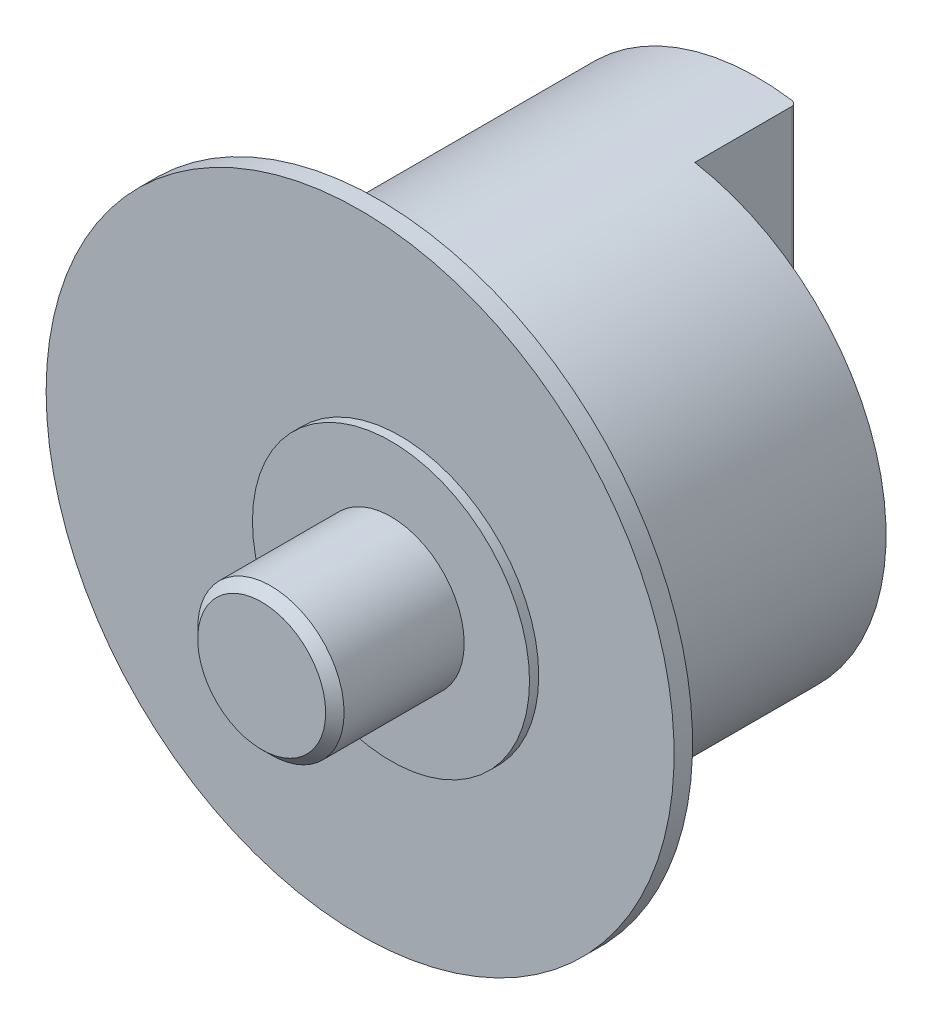
ISO-10303-21;
HEADER;
FILE_DESCRIPTION(('STEP AP214'),'2;1');
FILE_NAME('part.step','',(''),(''),'','','');
FILE_SCHEMA(('AUTOMOTIVE_DESIGN { 1 0 10303 214 1 1 1 1 }'));
ENDSEC;
DATA;
#1=APPLICATION_CONTEXT('core data for automotive mechanical design processes');
#2=APPLICATION_PROTOCOL_DEFINITION('international standard','automotive_design',2000,#1);
#3=PRODUCT_CONTEXT('',#1,'mechanical');
#4=PRODUCT('Part','Part','',(#3));
#5=PRODUCT_RELATED_PRODUCT_CATEGORY('part','',(#4));
#6=PRODUCT_DEFINITION_FORMATION('','',#4);
#7=PRODUCT_DEFINITION_CONTEXT('part definition',#1,'design');
#8=PRODUCT_DEFINITION('design','',#6,#7);
#9=PRODUCT_DEFINITION_SHAPE('','',#8);
#10=(LENGTH_UNIT() NAMED_UNIT(*) SI_UNIT(.MILLI.,.METRE.));
#11=(NAMED_UNIT(*) PLANE_ANGLE_UNIT() SI_UNIT($,.RADIAN.));
#12=(NAMED_UNIT(*) SI_UNIT($,.STERADIAN.) SOLID_ANGLE_UNIT());
#13=UNCERTAINTY_MEASURE_WITH_UNIT(LENGTH_MEASURE(1.E-05),#10,'distance_accuracy_value','');
#14=(GEOMETRIC_REPRESENTATION_CONTEXT(3) GLOBAL_UNCERTAINTY_ASSIGNED_CONTEXT((#13)) GLOBAL_UNIT_ASSIGNED_CONTEXT((#10,
#11,#12)) REPRESENTATION_CONTEXT('',''));
#15=CARTESIAN_POINT('',(0.,0.,0.));
#16=DIRECTION('',(0.,0.,1.));
#17=DIRECTION('',(1.,0.,0.));
#18=AXIS2_PLACEMENT_3D('',#15,#16,#17);
#19=CARTESIAN_POINT('',(0.,0.,0.));
#20=DIRECTION('',(0.,0.,1.));
#21=DIRECTION('',(1.,0.,0.));
#22=AXIS2_PLACEMENT_3D('',#19,#20,#21);
#23=PLANE('',#22);
#24=DIRECTION('',(0.,-1.,0.));
#25=VECTOR('',#24,1.);
#26=CARTESIAN_POINT('',(-0.0500000000000027,0.,0.));
#27=LINE('',#26,#25);
#28=CARTESIAN_POINT('',(-0.0500000000000027,-3.43910161513775,0.));
#29=VERTEX_POINT('',#28);
#30=CARTESIAN_POINT('',(-0.0500000000000027,-12.2935440374206,0.));
#31=VERTEX_POINT('',#30);
#32=EDGE_CURVE('E165',#29,#31,#27,.T.);
#33=ORIENTED_EDGE('',*,*,#32,.F.);
#34=DIRECTION('',(1.,0.,0.));
#35=VECTOR('',#34,1.);
#36=CARTESIAN_POINT('',(0.,-3.43910161513775,0.));
#37=LINE('',#36,#35);
#38=CARTESIAN_POINT('',(1.98556624327026,-3.43910161513775,0.));
#39=VERTEX_POINT('',#38);
#40=EDGE_CURVE('E213',#29,#39,#37,.T.);
#41=ORIENTED_EDGE('',*,*,#40,.T.);
#42=DIRECTION('',(0.499999999999999,0.866025403784439,0.));
#43=VECTOR('',#42,1.);
#44=CARTESIAN_POINT('',(2.97834936490539,-1.71955080756887,0.));
#45=LINE('',#44,#43);
#46=CARTESIAN_POINT('',(3.97113248654052,0.,0.));
#47=VERTEX_POINT('',#46);
#48=EDGE_CURVE('E193',#39,#47,#45,.T.);
#49=ORIENTED_EDGE('',*,*,#48,.T.);
#50=DIRECTION('',(-0.5,0.866025403784439,0.));
#51=VECTOR('',#50,1.);
#52=CARTESIAN_POINT('',(2.97834936490539,1.71955080756888,0.));
#53=LINE('',#52,#51);
#54=CARTESIAN_POINT('',(1.98556624327026,3.43910161513776,0.));
#55=VERTEX_POINT('',#54);
#56=EDGE_CURVE('E218',#47,#55,#53,.T.);
#57=ORIENTED_EDGE('',*,*,#56,.T.);
#58=DIRECTION('',(-1.,0.,0.));
#59=VECTOR('',#58,1.);
#60=CARTESIAN_POINT('',(0.,3.43910161513776,0.));
#61=LINE('',#60,#59);
#62=CARTESIAN_POINT('',(-0.0500000000000027,3.43910161513776,0.));
#63=VERTEX_POINT('',#62);
#64=EDGE_CURVE('E215',#55,#63,#61,.T.);
#65=ORIENTED_EDGE('',*,*,#64,.T.);
#66=CARTESIAN_POINT('',(-0.0500000000000027,12.2935440374206,0.));
#67=VERTEX_POINT('',#66);
#68=EDGE_CURVE('E162',#67,#63,#27,.T.);
#69=ORIENTED_EDGE('',*,*,#68,.F.);
#70=CARTESIAN_POINT('',(-2.17,0.,0.));
#71=DIRECTION('',(0.,0.,1.));
#72=DIRECTION('',(1.,0.,0.));
#73=AXIS2_PLACEMENT_3D('',#70,#71,#72);
#74=CIRCLE('',#73,12.475);
#75=EDGE_CURVE('E198',#31,#67,#74,.T.);
#76=ORIENTED_EDGE('',*,*,#75,.F.);
#77=EDGE_LOOP('',(#33,#41,#49,#57,#65,#69,#76));
#78=FACE_BOUND('',#77,.T.);
#79=ADVANCED_FACE('F39',(#78),#23,.F.);
#80=CARTESIAN_POINT('',(2.97834936490539,-1.71955080756887,10.5));
#81=DIRECTION('',(-0.866025403784439,0.499999999999999,0.));
#82=DIRECTION('',(-0.499999999999999,-0.866025403784439,0.));
#83=AXIS2_PLACEMENT_3D('',#80,#81,#82);
#84=PLANE('',#83);
#85=ORIENTED_EDGE('',*,*,#48,.F.);
#86=DIRECTION('',(0.,0.,-1.));
#87=VECTOR('',#86,1.);
#88=CARTESIAN_POINT('',(1.98556624327026,-3.43910161513775,10.5));
#89=LINE('',#88,#87);
#90=CARTESIAN_POINT('',(1.98556624327026,-3.43910161513775,10.5));
#91=VERTEX_POINT('',#90);
#92=EDGE_CURVE('E184',#91,#39,#89,.T.);
#93=ORIENTED_EDGE('',*,*,#92,.F.);
#94=DIRECTION('',(0.499999999999999,0.866025403784439,0.));
#95=VECTOR('',#94,1.);
#96=CARTESIAN_POINT('',(2.97834936490539,-1.71955080756887,10.5));
#97=LINE('',#96,#95);
#98=CARTESIAN_POINT('',(3.97113248654052,0.,10.5));
#99=VERTEX_POINT('',#98);
#100=EDGE_CURVE('E194',#91,#99,#97,.T.);
#101=ORIENTED_EDGE('',*,*,#100,.T.);
#102=DIRECTION('',(0.,0.,-1.));
#103=VECTOR('',#102,1.);
#104=CARTESIAN_POINT('',(3.97113248654052,0.,10.5));
#105=LINE('',#104,#103);
#106=EDGE_CURVE('E210',#99,#47,#105,.T.);
#107=ORIENTED_EDGE('',*,*,#106,.T.);
#108=EDGE_LOOP('',(#85,#93,#101,#107));
#109=FACE_BOUND('',#108,.T.);
#110=ADVANCED_FACE('F276',(#109),#84,.T.);
#111=CARTESIAN_POINT('',(0.,-3.43910161513775,10.5));
#112=DIRECTION('',(0.,1.,0.));
#113=DIRECTION('',(-1.,0.,0.));
#114=AXIS2_PLACEMENT_3D('',#111,#112,#113);
#115=PLANE('',#114);
#116=DIRECTION('',(0.,0.,1.));
#117=VECTOR('',#116,1.);
#118=CARTESIAN_POINT('',(-0.0500000000000027,-3.43910161513775,-5.5));
#119=LINE('',#118,#117);
#120=CARTESIAN_POINT('',(-0.0500000000000027,-3.43910161513775,-5.25));
#121=VERTEX_POINT('',#120);
#122=EDGE_CURVE('E167',#121,#29,#119,.T.);
#123=ORIENTED_EDGE('',*,*,#122,.F.);
#124=CARTESIAN_POINT('',(-0.300000000000003,-3.43910161513775,-5.25));
#125=DIRECTION('',(0.,1.,0.));
#126=DIRECTION('',(-1.,0.,0.));
#127=AXIS2_PLACEMENT_3D('',#124,#125,#126);
#128=CIRCLE('',#127,0.25);
#129=CARTESIAN_POINT('',(-0.300000000000003,-3.43910161513775,-5.5));
#130=VERTEX_POINT('',#129);
#131=EDGE_CURVE('E318',#121,#130,#128,.T.);
#132=ORIENTED_EDGE('',*,*,#131,.T.);
#133=DIRECTION('',(1.,0.,0.));
#134=VECTOR('',#133,1.);
#135=CARTESIAN_POINT('',(0.,-3.43910161513775,-5.5));
#136=LINE('',#135,#134);
#137=CARTESIAN_POINT('',(-1.98556624327026,-3.43910161513776,-5.5));
#138=VERTEX_POINT('',#137);
#139=EDGE_CURVE('E156',#138,#130,#136,.T.);
#140=ORIENTED_EDGE('',*,*,#139,.F.);
#141=DIRECTION('',(0.,0.,-1.));
#142=VECTOR('',#141,1.);
#143=CARTESIAN_POINT('',(-1.98556624327026,-3.43910161513776,10.5));
#144=LINE('',#143,#142);
#145=CARTESIAN_POINT('',(-1.98556624327026,-3.43910161513776,10.5));
#146=VERTEX_POINT('',#145);
#147=EDGE_CURVE('E226',#146,#138,#144,.T.);
#148=ORIENTED_EDGE('',*,*,#147,.F.);
#149=DIRECTION('',(1.,0.,0.));
#150=VECTOR('',#149,1.);
#151=CARTESIAN_POINT('',(0.,-3.43910161513775,10.5));
#152=LINE('',#151,#150);
#153=EDGE_CURVE('E197',#146,#91,#152,.T.);
#154=ORIENTED_EDGE('',*,*,#153,.T.);
#155=ORIENTED_EDGE('',*,*,#92,.T.);
#156=ORIENTED_EDGE('',*,*,#40,.F.);
#157=EDGE_LOOP('',(#123,#132,#140,#148,#154,#155,#156));
#158=FACE_BOUND('',#157,.T.);
#159=ADVANCED_FACE('F272',(#158),#115,.T.);
#160=CARTESIAN_POINT('',(-2.97834936490539,-1.71955080756888,10.5));
#161=DIRECTION('',(0.866025403784438,0.500000000000001,0.));
#162=DIRECTION('',(-0.500000000000001,0.866025403784438,0.));
#163=AXIS2_PLACEMENT_3D('',#160,#161,#162);
#164=PLANE('',#163);
#165=ORIENTED_EDGE('',*,*,#147,.T.);
#166=DIRECTION('',(0.500000000000001,-0.866025403784438,0.));
#167=VECTOR('',#166,1.);
#168=CARTESIAN_POINT('',(-2.97834936490539,-1.71955080756888,-5.5));
#169=LINE('',#168,#167);
#170=CARTESIAN_POINT('',(-3.97113248654052,0.,-5.5));
#171=VERTEX_POINT('',#170);
#172=EDGE_CURVE('E154',#171,#138,#169,.T.);
#173=ORIENTED_EDGE('',*,*,#172,.F.);
#174=DIRECTION('',(0.,0.,-1.));
#175=VECTOR('',#174,1.);
#176=CARTESIAN_POINT('',(-3.97113248654052,0.,10.5));
#177=LINE('',#176,#175);
#178=CARTESIAN_POINT('',(-3.97113248654052,0.,10.5));
#179=VERTEX_POINT('',#178);
#180=EDGE_CURVE('E149',#179,#171,#177,.T.);
#181=ORIENTED_EDGE('',*,*,#180,.F.);
#182=DIRECTION('',(0.500000000000001,-0.866025403784438,0.));
#183=VECTOR('',#182,1.);
#184=CARTESIAN_POINT('',(-2.97834936490539,-1.71955080756888,10.5));
#185=LINE('',#184,#183);
#186=EDGE_CURVE('E201',#179,#146,#185,.T.);
#187=ORIENTED_EDGE('',*,*,#186,.T.);
#188=EDGE_LOOP('',(#165,#173,#181,#187));
#189=FACE_BOUND('',#188,.T.);
#190=ADVANCED_FACE('F269',(#189),#164,.T.);
#191=CARTESIAN_POINT('',(-2.97834936490539,1.71955080756887,10.5));
#192=DIRECTION('',(0.866025403784439,-0.499999999999999,0.));
#193=DIRECTION('',(0.499999999999999,0.866025403784439,0.));
#194=AXIS2_PLACEMENT_3D('',#191,#192,#193);
#195=PLANE('',#194);
#196=ORIENTED_EDGE('',*,*,#180,.T.);
#197=DIRECTION('',(-0.499999999999999,-0.866025403784439,0.));
#198=VECTOR('',#197,1.);
#199=CARTESIAN_POINT('',(-2.97834936490539,1.71955080756887,-5.5));
#200=LINE('',#199,#198);
#201=CARTESIAN_POINT('',(-1.98556624327026,3.43910161513775,-5.5));
#202=VERTEX_POINT('',#201);
#203=EDGE_CURVE('E134',#202,#171,#200,.T.);
#204=ORIENTED_EDGE('',*,*,#203,.F.);
#205=DIRECTION('',(0.,0.,-1.));
#206=VECTOR('',#205,1.);
#207=CARTESIAN_POINT('',(-1.98556624327026,3.43910161513775,10.5));
#208=LINE('',#207,#206);
#209=CARTESIAN_POINT('',(-1.98556624327026,3.43910161513775,10.5));
#210=VERTEX_POINT('',#209);
#211=EDGE_CURVE('E143',#210,#202,#208,.T.);
#212=ORIENTED_EDGE('',*,*,#211,.F.);
#213=DIRECTION('',(-0.499999999999999,-0.866025403784439,0.));
#214=VECTOR('',#213,1.);
#215=CARTESIAN_POINT('',(-2.97834936490539,1.71955080756887,10.5));
#216=LINE('',#215,#214);
#217=EDGE_CURVE('E204',#210,#179,#216,.T.);
#218=ORIENTED_EDGE('',*,*,#217,.T.);
#219=EDGE_LOOP('',(#196,#204,#212,#218));
#220=FACE_BOUND('',#219,.T.);
#221=ADVANCED_FACE('F152',(#220),#195,.T.);
#222=CARTESIAN_POINT('',(0.,3.43910161513776,10.5));
#223=DIRECTION('',(0.,-1.,0.));
#224=DIRECTION('',(1.,0.,0.));
#225=AXIS2_PLACEMENT_3D('',#222,#223,#224);
#226=PLANE('',#225);
#227=DIRECTION('',(-1.,0.,0.));
#228=VECTOR('',#227,1.);
#229=CARTESIAN_POINT('',(0.,3.43910161513776,-5.5));
#230=LINE('',#229,#228);
#231=CARTESIAN_POINT('',(-0.300000000000003,3.43910161513776,-5.5));
#232=VERTEX_POINT('',#231);
#233=EDGE_CURVE('E128',#232,#202,#230,.T.);
#234=ORIENTED_EDGE('',*,*,#233,.F.);
#235=CARTESIAN_POINT('',(-0.300000000000003,3.43910161513776,-5.25));
#236=DIRECTION('',(0.,-1.,0.));
#237=DIRECTION('',(1.,0.,0.));
#238=AXIS2_PLACEMENT_3D('',#235,#236,#237);
#239=CIRCLE('',#238,0.25);
#240=CARTESIAN_POINT('',(-0.0500000000000027,3.43910161513776,-5.25));
#241=VERTEX_POINT('',#240);
#242=EDGE_CURVE('E48',#232,#241,#239,.T.);
#243=ORIENTED_EDGE('',*,*,#242,.T.);
#244=DIRECTION('',(0.,0.,1.));
#245=VECTOR('',#244,1.);
#246=CARTESIAN_POINT('',(-0.0500000000000027,3.43910161513776,-5.5));
#247=LINE('',#246,#245);
#248=EDGE_CURVE('E169',#241,#63,#247,.T.);
#249=ORIENTED_EDGE('',*,*,#248,.T.);
#250=ORIENTED_EDGE('',*,*,#64,.F.);
#251=DIRECTION('',(0.,0.,-1.));
#252=VECTOR('',#251,1.);
#253=CARTESIAN_POINT('',(1.98556624327026,3.43910161513776,10.5));
#254=LINE('',#253,#252);
#255=CARTESIAN_POINT('',(1.98556624327026,3.43910161513776,10.5));
#256=VERTEX_POINT('',#255);
#257=EDGE_CURVE('E150',#256,#55,#254,.T.);
#258=ORIENTED_EDGE('',*,*,#257,.F.);
#259=DIRECTION('',(-1.,0.,0.));
#260=VECTOR('',#259,1.);
#261=CARTESIAN_POINT('',(0.,3.43910161513776,10.5));
#262=LINE('',#261,#260);
#263=EDGE_CURVE('E146',#256,#210,#262,.T.);
#264=ORIENTED_EDGE('',*,*,#263,.T.);
#265=ORIENTED_EDGE('',*,*,#211,.T.);
#266=EDGE_LOOP('',(#234,#243,#249,#250,#258,#264,#265));
#267=FACE_BOUND('',#266,.T.);
#268=ADVANCED_FACE('F144',(#267),#226,.T.);
#269=CARTESIAN_POINT('',(2.97834936490539,1.71955080756888,10.5));
#270=DIRECTION('',(-0.866025403784438,-0.5,0.));
#271=DIRECTION('',(0.5,-0.866025403784439,0.));
#272=AXIS2_PLACEMENT_3D('',#269,#270,#271);
#273=PLANE('',#272);
#274=ORIENTED_EDGE('',*,*,#56,.F.);
#275=ORIENTED_EDGE('',*,*,#106,.F.);
#276=DIRECTION('',(-0.5,0.866025403784439,0.));
#277=VECTOR('',#276,1.);
#278=CARTESIAN_POINT('',(2.97834936490539,1.71955080756888,10.5));
#279=LINE('',#278,#277);
#280=EDGE_CURVE('E207',#99,#256,#279,.T.);
#281=ORIENTED_EDGE('',*,*,#280,.T.);
#282=ORIENTED_EDGE('',*,*,#257,.T.);
#283=EDGE_LOOP('',(#274,#275,#281,#282));
#284=FACE_BOUND('',#283,.T.);
#285=ADVANCED_FACE('F258',(#284),#273,.T.);
#286=CARTESIAN_POINT('',(-2.17,0.,10.5));
#287=DIRECTION('',(0.,0.,-1.));
#288=DIRECTION('',(-1.,0.,0.));
#289=AXIS2_PLACEMENT_3D('',#286,#287,#288);
#290=CYLINDRICAL_SURFACE('',#289,12.475);
#291=CARTESIAN_POINT('',(-2.17,0.,-5.5));
#292=DIRECTION('',(0.,0.,-1.));
#293=DIRECTION('',(-1.,0.,0.));
#294=AXIS2_PLACEMENT_3D('',#291,#292,#293);
#295=CIRCLE('',#294,12.475);
#296=CARTESIAN_POINT('',(-0.300000000000003,-12.3340473892393,-5.5));
#297=VERTEX_POINT('',#296);
#298=CARTESIAN_POINT('',(-0.300000000000003,12.3340473892393,-5.5));
#299=VERTEX_POINT('',#298);
#300=EDGE_CURVE('E139',#297,#299,#295,.T.);
#301=ORIENTED_EDGE('',*,*,#300,.F.);
#302=CARTESIAN_POINT('',(-0.300000000000003,-12.3340473892393,-5.5));
#303=CARTESIAN_POINT('',(-0.285791000716246,-12.3318940895574,-5.50001123130131));
#304=CARTESIAN_POINT('',(-0.271589234332642,-12.3297148618557,-5.49878930036646));
#305=CARTESIAN_POINT('',(-0.243600418387116,-12.325372357916,-5.4939654120315));
#306=CARTESIAN_POINT('',(-0.229813162523789,-12.3232090741615,-5.49036465977805));
#307=CARTESIAN_POINT('',(-0.203031371075315,-12.3189628301858,-5.48086675951723));
#308=CARTESIAN_POINT('',(-0.190037257731231,-12.3168799129623,-5.47496840046803));
#309=CARTESIAN_POINT('',(-0.165224556254207,-12.3128655504015,-5.46103987969917));
#310=CARTESIAN_POINT('',(-0.153405690006534,-12.3109340692508,-5.45301022399551));
#311=CARTESIAN_POINT('',(-0.131330012083573,-12.3072976193401,-5.43507278953461));
#312=CARTESIAN_POINT('',(-0.12106718308193,-12.3055917814447,-5.42517259645071));
#313=CARTESIAN_POINT('',(-0.102351753722814,-12.3024609726893,-5.40374487469567));
#314=CARTESIAN_POINT('',(-0.093899444495315,-12.3010360470027,-5.39221708480212));
#315=CARTESIAN_POINT('',(-0.0791545462218776,-12.2985383590346,-5.36800806871606));
#316=CARTESIAN_POINT('',(-0.0728378388534461,-12.2974616704216,-5.35534192057916));
#317=CARTESIAN_POINT('',(-0.0624272210677853,-12.2956817660597,-5.32910708589132));
#318=CARTESIAN_POINT('',(-0.0583315564599712,-12.2949782555826,-5.3155391211359));
#319=CARTESIAN_POINT('',(-0.0536116228256961,-12.294166441249,-5.29322565759889));
#320=CARTESIAN_POINT('',(-0.0522580893788639,-12.2939332847654,-5.2846321068289));
#321=CARTESIAN_POINT('',(-0.0504524751021059,-12.2936220684098,-5.26736036660926));
#322=CARTESIAN_POINT('',(-0.0499991224382943,-12.293543789717,-5.25868231400678));
#323=CARTESIAN_POINT('',(-0.0499999999994821,-12.2935440374208,-5.2500000000001));
#324=B_SPLINE_CURVE_WITH_KNOTS('',3,(#302,#303,#304,#305,#306,#307,#308,#309,#310,#311,#312,
#313,#314,#315,#316,#317,#318,#319,#320,#321,#322,#323),.UNSPECIFIED.,.F.,.F.,(4,2,2,2,2,2,2,2,
2,2,4),(0.,0.0430573283241415,0.086092859868414,0.129151105701858,0.172199137705064,
0.215076203177284,0.257960158076531,0.300342225717843,0.342690770858999,0.368754075234748,
0.394780529404282),.UNSPECIFIED.);
#325=CARTESIAN_POINT('',(-0.0500000000000027,-12.2935440374206,-5.25));
#326=VERTEX_POINT('',#325);
#327=EDGE_CURVE('E246',#297,#326,#324,.T.);
#328=ORIENTED_EDGE('',*,*,#327,.T.);
#329=DIRECTION('',(0.,0.,1.));
#330=VECTOR('',#329,1.);
#331=CARTESIAN_POINT('',(-0.0500000000000027,-12.2935440374206,-5.5));
#332=LINE('',#331,#330);
#333=EDGE_CURVE('E161',#326,#31,#332,.T.);
#334=ORIENTED_EDGE('',*,*,#333,.T.);
#335=ORIENTED_EDGE('',*,*,#75,.T.);
#336=DIRECTION('',(0.,0.,1.));
#337=VECTOR('',#336,1.);
#338=CARTESIAN_POINT('',(-0.0500000000000027,12.2935440374206,-5.5));
#339=LINE('',#338,#337);
#340=CARTESIAN_POINT('',(-0.0500000000000027,12.2935440374206,-5.25));
#341=VERTEX_POINT('',#340);
#342=EDGE_CURVE('E171',#341,#67,#339,.T.);
#343=ORIENTED_EDGE('',*,*,#342,.F.);
#344=CARTESIAN_POINT('',(-0.0500000000000027,12.2935440374206,-5.25));
#345=CARTESIAN_POINT('',(-0.0499874111538393,12.2935411927369,-5.26392180070361));
#346=CARTESIAN_POINT('',(-0.0511621089362231,12.2937444316417,-5.27783868601261));
#347=CARTESIAN_POINT('',(-0.0557915631038157,12.2945417795484,-5.30525958704281));
#348=CARTESIAN_POINT('',(-0.0592435236815308,12.2951354092627,-5.31876408780665));
#349=CARTESIAN_POINT('',(-0.068334879151295,12.2966925888109,-5.3449974304209));
#350=CARTESIAN_POINT('',(-0.0739749806171015,12.2976562581333,-5.35772602018364));
#351=CARTESIAN_POINT('',(-0.0872683718238603,12.2999146155236,-5.38205013424811));
#352=CARTESIAN_POINT('',(-0.0949215647383564,12.3012092876708,-5.39364571300906));
#353=CARTESIAN_POINT('',(-0.112076512153034,12.3040908548348,-5.41546510493174));
#354=CARTESIAN_POINT('',(-0.121590470454247,12.3056796751284,-5.42567906489613));
#355=CARTESIAN_POINT('',(-0.14216109661643,12.3090861923949,-5.44437092005289));
#356=CARTESIAN_POINT('',(-0.153218116134828,12.3109039415304,-5.45284841842283));
#357=CARTESIAN_POINT('',(-0.176721546972354,12.314731402878,-5.46794541649389));
#358=CARTESIAN_POINT('',(-0.189184803222894,12.3167433888321,-5.47453809033206));
#359=CARTESIAN_POINT('',(-0.215023841465911,12.3208710737789,-5.48553336644723));
#360=CARTESIAN_POINT('',(-0.228399223563233,12.3229867272086,-5.48993692154906));
#361=CARTESIAN_POINT('',(-0.251530945889504,12.3266051242313,-5.49545084701701));
#362=CARTESIAN_POINT('',(-0.261151491895811,12.3280986895493,-5.49715537071291));
#363=CARTESIAN_POINT('',(-0.280512836988484,12.3310810641784,-5.49942991826654));
#364=CARTESIAN_POINT('',(-0.290253454167941,12.3325698771979,-5.50000148627753));
#365=CARTESIAN_POINT('',(-0.299999999999438,12.3340473892392,-5.50000000000239));
#366=B_SPLINE_CURVE_WITH_KNOTS('',3,(#344,#345,#346,#347,#348,#349,#350,#351,#352,#353,#354,
#355,#356,#357,#358,#359,#360,#361,#362,#363,#364,#365),.UNSPECIFIED.,.F.,.F.,(4,2,2,2,2,2,2,2,
2,2,4),(0.,0.0417071546907407,0.0833632003425542,0.125032708381418,0.166700212550435,
0.208650756375375,0.250610876219945,0.293141434364316,0.335653464628272,0.365242933841662,
0.394792046509531),.UNSPECIFIED.);
#367=EDGE_CURVE('E239',#341,#299,#366,.T.);
#368=ORIENTED_EDGE('',*,*,#367,.T.);
#369=EDGE_LOOP('',(#301,#328,#334,#335,#343,#368));
#370=FACE_BOUND('',#369,.T.);
#371=CARTESIAN_POINT('',(-2.17,0.,15.));
#372=DIRECTION('',(0.,0.,1.));
#373=DIRECTION('',(1.,0.,0.));
#374=AXIS2_PLACEMENT_3D('',#371,#372,#373);
#375=CIRCLE('',#374,12.475);
#376=CARTESIAN_POINT('',(10.305,0.,15.));
#377=VERTEX_POINT('',#376);
#378=EDGE_CURVE('E188',#377,#377,#375,.T.);
#379=ORIENTED_EDGE('',*,*,#378,.F.);
#380=EDGE_LOOP('',(#379));
#381=FACE_BOUND('',#380,.T.);
#382=ADVANCED_FACE('F252',(#370,#381),#290,.T.);
#383=CARTESIAN_POINT('',(-2.17,0.,10.5));
#384=DIRECTION('',(0.,0.,1.));
#385=DIRECTION('',(1.,0.,0.));
#386=AXIS2_PLACEMENT_3D('',#383,#384,#385);
#387=PLANE('',#386);
#388=ORIENTED_EDGE('',*,*,#100,.F.);
#389=ORIENTED_EDGE('',*,*,#153,.F.);
#390=ORIENTED_EDGE('',*,*,#186,.F.);
#391=ORIENTED_EDGE('',*,*,#217,.F.);
#392=ORIENTED_EDGE('',*,*,#263,.F.);
#393=ORIENTED_EDGE('',*,*,#280,.F.);
#394=EDGE_LOOP('',(#388,#389,#390,#391,#392,#393));
#395=FACE_BOUND('',#394,.T.);
#396=ADVANCED_FACE('F257',(#395),#387,.F.);
#397=CARTESIAN_POINT('',(-2.17,0.,16.));
#398=DIRECTION('',(0.,0.,-1.));
#399=DIRECTION('',(-1.,0.,0.));
#400=AXIS2_PLACEMENT_3D('',#397,#398,#399);
#401=CYLINDRICAL_SURFACE('',#400,17.);
#402=CARTESIAN_POINT('',(-2.17,0.,16.));
#403=DIRECTION('',(0.,0.,-1.));
#404=DIRECTION('',(-1.,0.,0.));
#405=AXIS2_PLACEMENT_3D('',#402,#403,#404);
#406=CIRCLE('',#405,17.);
#407=CARTESIAN_POINT('',(-19.17,0.,16.));
#408=VERTEX_POINT('',#407);
#409=EDGE_CURVE('E185',#408,#408,#406,.T.);
#410=ORIENTED_EDGE('',*,*,#409,.T.);
#411=EDGE_LOOP('',(#410));
#412=FACE_BOUND('',#411,.T.);
#413=CARTESIAN_POINT('',(-2.17,0.,15.));
#414=DIRECTION('',(0.,0.,-1.));
#415=DIRECTION('',(-1.,0.,0.));
#416=AXIS2_PLACEMENT_3D('',#413,#414,#415);
#417=CIRCLE('',#416,17.);
#418=CARTESIAN_POINT('',(-19.17,0.,15.));
#419=VERTEX_POINT('',#418);
#420=EDGE_CURVE('E181',#419,#419,#417,.T.);
#421=ORIENTED_EDGE('',*,*,#420,.F.);
#422=EDGE_LOOP('',(#421));
#423=FACE_BOUND('',#422,.T.);
#424=ADVANCED_FACE('F325',(#412,#423),#401,.T.);
#425=CARTESIAN_POINT('',(-2.17,0.,16.));
#426=DIRECTION('',(0.,0.,-1.));
#427=DIRECTION('',(-1.,0.,0.));
#428=AXIS2_PLACEMENT_3D('',#425,#426,#427);
#429=PLANE('',#428);
#430=CARTESIAN_POINT('',(0.,0.,16.));
#431=DIRECTION('',(0.,0.,1.));
#432=DIRECTION('',(1.,0.,0.));
#433=AXIS2_PLACEMENT_3D('',#430,#431,#432);
#434=CIRCLE('',#433,7.5);
#435=CARTESIAN_POINT('',(7.5,0.,16.));
#436=VERTEX_POINT('',#435);
#437=EDGE_CURVE('E178',#436,#436,#434,.T.);
#438=ORIENTED_EDGE('',*,*,#437,.F.);
#439=EDGE_LOOP('',(#438));
#440=FACE_BOUND('',#439,.T.);
#441=ORIENTED_EDGE('',*,*,#409,.F.);
#442=EDGE_LOOP('',(#441));
#443=FACE_BOUND('',#442,.T.);
#444=ADVANCED_FACE('F329',(#440,#443),#429,.F.);
#445=CARTESIAN_POINT('',(-2.17,0.,15.));
#446=DIRECTION('',(0.,0.,-1.));
#447=DIRECTION('',(-1.,0.,0.));
#448=AXIS2_PLACEMENT_3D('',#445,#446,#447);
#449=PLANE('',#448);
#450=ORIENTED_EDGE('',*,*,#378,.T.);
#451=EDGE_LOOP('',(#450));
#452=FACE_BOUND('',#451,.T.);
#453=ORIENTED_EDGE('',*,*,#420,.T.);
#454=EDGE_LOOP('',(#453));
#455=FACE_BOUND('',#454,.T.);
#456=ADVANCED_FACE('F333',(#452,#455),#449,.T.);
#457=CARTESIAN_POINT('',(0.,0.,16.5));
#458=DIRECTION('',(0.,0.,-1.));
#459=DIRECTION('',(-1.,0.,0.));
#460=AXIS2_PLACEMENT_3D('',#457,#458,#459);
#461=CYLINDRICAL_SURFACE('',#460,7.5);
#462=CARTESIAN_POINT('',(0.,0.,16.5));
#463=DIRECTION('',(0.,0.,1.));
#464=DIRECTION('',(1.,0.,0.));
#465=AXIS2_PLACEMENT_3D('',#462,#463,#464);
#466=CIRCLE('',#465,7.5);
#467=CARTESIAN_POINT('',(7.5,0.,16.5));
#468=VERTEX_POINT('',#467);
#469=EDGE_CURVE('E173',#468,#468,#466,.T.);
#470=ORIENTED_EDGE('',*,*,#469,.F.);
#471=EDGE_LOOP('',(#470));
#472=FACE_BOUND('',#471,.T.);
#473=ORIENTED_EDGE('',*,*,#437,.T.);
#474=EDGE_LOOP('',(#473));
#475=FACE_BOUND('',#474,.T.);
#476=ADVANCED_FACE('F336',(#472,#475),#461,.T.);
#477=CARTESIAN_POINT('',(0.,0.,16.5));
#478=DIRECTION('',(0.,0.,1.));
#479=DIRECTION('',(1.,0.,0.));
#480=AXIS2_PLACEMENT_3D('',#477,#478,#479);
#481=PLANE('',#480);
#482=CARTESIAN_POINT('',(0.,0.,16.5));
#483=DIRECTION('',(0.,0.,1.));
#484=DIRECTION('',(1.,0.,0.));
#485=AXIS2_PLACEMENT_3D('',#482,#483,#484);
#486=CIRCLE('',#485,3.9625);
#487=CARTESIAN_POINT('',(3.9625,0.,16.5));
#488=VERTEX_POINT('',#487);
#489=EDGE_CURVE('E174',#488,#488,#486,.T.);
#490=ORIENTED_EDGE('',*,*,#489,.F.);
#491=EDGE_LOOP('',(#490));
#492=FACE_BOUND('',#491,.T.);
#493=ORIENTED_EDGE('',*,*,#469,.T.);
#494=EDGE_LOOP('',(#493));
#495=FACE_BOUND('',#494,.T.);
#496=ADVANCED_FACE('F343',(#492,#495),#481,.T.);
#497=CARTESIAN_POINT('',(0.,0.,23.5));
#498=DIRECTION('',(0.,0.,-1.));
#499=DIRECTION('',(-1.,0.,0.));
#500=AXIS2_PLACEMENT_3D('',#497,#498,#499);
#501=CYLINDRICAL_SURFACE('',#500,3.9625);
#502=CARTESIAN_POINT('',(0.,0.,23.));
#503=DIRECTION('',(0.,0.,1.));
#504=DIRECTION('',(1.,0.,0.));
#505=AXIS2_PLACEMENT_3D('',#502,#503,#504);
#506=CIRCLE('',#505,3.9625);
#507=CARTESIAN_POINT('',(3.9625,0.,23.));
#508=VERTEX_POINT('',#507);
#509=EDGE_CURVE('E232',#508,#508,#506,.F.);
#510=ORIENTED_EDGE('',*,*,#509,.T.);
#511=EDGE_LOOP('',(#510));
#512=FACE_BOUND('',#511,.T.);
#513=ORIENTED_EDGE('',*,*,#489,.T.);
#514=EDGE_LOOP('',(#513));
#515=FACE_BOUND('',#514,.T.);
#516=ADVANCED_FACE('F347',(#512,#515),#501,.T.);
#517=CARTESIAN_POINT('',(0.,0.,23.5));
#518=DIRECTION('',(0.,0.,1.));
#519=DIRECTION('',(1.,0.,0.));
#520=AXIS2_PLACEMENT_3D('',#517,#518,#519);
#521=PLANE('',#520);
#522=CARTESIAN_POINT('',(0.,0.,23.5));
#523=DIRECTION('',(0.,0.,1.));
#524=DIRECTION('',(1.,0.,0.));
#525=AXIS2_PLACEMENT_3D('',#522,#523,#524);
#526=CIRCLE('',#525,3.4625);
#527=CARTESIAN_POINT('',(3.4625,0.,23.5));
#528=VERTEX_POINT('',#527);
#529=EDGE_CURVE('E177',#528,#528,#526,.T.);
#530=ORIENTED_EDGE('',*,*,#529,.T.);
#531=EDGE_LOOP('',(#530));
#532=FACE_BOUND('',#531,.T.);
#533=ADVANCED_FACE('F351',(#532),#521,.T.);
#534=CARTESIAN_POINT('',(-0.0500000000000027,0.,-5.5));
#535=DIRECTION('',(-1.,0.,0.));
#536=DIRECTION('',(0.,0.,1.));
#537=AXIS2_PLACEMENT_3D('',#534,#535,#536);
#538=PLANE('',#537);
#539=ORIENTED_EDGE('',*,*,#248,.F.);
#540=DIRECTION('',(0.,-1.,0.));
#541=VECTOR('',#540,1.);
#542=CARTESIAN_POINT('',(-0.0500000000000027,12.2935440374206,-5.25));
#543=LINE('',#542,#541);
#544=EDGE_CURVE('E11',#241,#341,#543,.F.);
#545=ORIENTED_EDGE('',*,*,#544,.T.);
#546=ORIENTED_EDGE('',*,*,#342,.T.);
#547=ORIENTED_EDGE('',*,*,#68,.T.);
#548=EDGE_LOOP('',(#539,#545,#546,#547));
#549=FACE_BOUND('',#548,.T.);
#550=ADVANCED_FACE('F312',(#549),#538,.F.);
#551=ORIENTED_EDGE('',*,*,#333,.F.);
#552=DIRECTION('',(0.,-1.,0.));
#553=VECTOR('',#552,1.);
#554=CARTESIAN_POINT('',(-0.0500000000000027,-3.43910161513775,-5.25));
#555=LINE('',#554,#553);
#556=EDGE_CURVE('E62',#326,#121,#555,.F.);
#557=ORIENTED_EDGE('',*,*,#556,.T.);
#558=ORIENTED_EDGE('',*,*,#122,.T.);
#559=ORIENTED_EDGE('',*,*,#32,.T.);
#560=EDGE_LOOP('',(#551,#557,#558,#559));
#561=FACE_BOUND('',#560,.T.);
#562=ADVANCED_FACE('F321',(#561),#538,.F.);
#563=CARTESIAN_POINT('',(0.,0.,-5.5));
#564=DIRECTION('',(0.,0.,-1.));
#565=DIRECTION('',(-1.,0.,0.));
#566=AXIS2_PLACEMENT_3D('',#563,#564,#565);
#567=PLANE('',#566);
#568=ORIENTED_EDGE('',*,*,#139,.T.);
#569=DIRECTION('',(0.,-1.,0.));
#570=VECTOR('',#569,1.);
#571=CARTESIAN_POINT('',(-0.300000000000003,-12.2935440374206,-5.5));
#572=LINE('',#571,#570);
#573=EDGE_CURVE('E236',#130,#297,#572,.T.);
#574=ORIENTED_EDGE('',*,*,#573,.T.);
#575=ORIENTED_EDGE('',*,*,#300,.T.);
#576=DIRECTION('',(0.,-1.,0.));
#577=VECTOR('',#576,1.);
#578=CARTESIAN_POINT('',(-0.300000000000003,3.43910161513776,-5.5));
#579=LINE('',#578,#577);
#580=EDGE_CURVE('E138',#299,#232,#579,.T.);
#581=ORIENTED_EDGE('',*,*,#580,.T.);
#582=ORIENTED_EDGE('',*,*,#233,.T.);
#583=ORIENTED_EDGE('',*,*,#203,.T.);
#584=ORIENTED_EDGE('',*,*,#172,.T.);
#585=EDGE_LOOP('',(#568,#574,#575,#581,#582,#583,#584));
#586=FACE_BOUND('',#585,.T.);
#587=ADVANCED_FACE('F131',(#586),#567,.T.);
#588=CARTESIAN_POINT('',(0.,0.,23.5));
#589=DIRECTION('',(0.,0.,-1.));
#590=DIRECTION('',(-1.,0.,0.));
#591=AXIS2_PLACEMENT_3D('',#588,#589,#590);
#592=CONICAL_SURFACE('',#591,3.4625,0.785398163397447);
#593=ORIENTED_EDGE('',*,*,#509,.F.);
#594=EDGE_LOOP('',(#593));
#595=FACE_BOUND('',#594,.T.);
#596=ORIENTED_EDGE('',*,*,#529,.F.);
#597=EDGE_LOOP('',(#596));
#598=FACE_BOUND('',#597,.T.);
#599=ADVANCED_FACE('F282',(#595,#598),#592,.T.);
#600=CARTESIAN_POINT('',(-0.300000000000003,0.,-5.25));
#601=DIRECTION('',(0.,1.,0.));
#602=DIRECTION('',(0.,0.,1.));
#603=AXIS2_PLACEMENT_3D('',#600,#601,#602);
#604=CYLINDRICAL_SURFACE('',#603,0.25);
#605=ORIENTED_EDGE('',*,*,#131,.F.);
#606=ORIENTED_EDGE('',*,*,#556,.F.);
#607=ORIENTED_EDGE('',*,*,#327,.F.);
#608=ORIENTED_EDGE('',*,*,#573,.F.);
#609=EDGE_LOOP('',(#605,#606,#607,#608));
#610=FACE_BOUND('',#609,.T.);
#611=ADVANCED_FACE('F286',(#610),#604,.T.);
#612=CARTESIAN_POINT('',(-0.300000000000003,0.,-5.25));
#613=DIRECTION('',(0.,1.,0.));
#614=DIRECTION('',(0.,0.,1.));
#615=AXIS2_PLACEMENT_3D('',#612,#613,#614);
#616=CYLINDRICAL_SURFACE('',#615,0.25);
#617=ORIENTED_EDGE('',*,*,#367,.F.);
#618=ORIENTED_EDGE('',*,*,#544,.F.);
#619=ORIENTED_EDGE('',*,*,#242,.F.);
#620=ORIENTED_EDGE('',*,*,#580,.F.);
#621=EDGE_LOOP('',(#617,#618,#619,#620));
#622=FACE_BOUND('',#621,.T.);
#623=ADVANCED_FACE('F41',(#622),#616,.T.);
#624=CLOSED_SHELL('',(#79,#110,#159,#190,#221,#268,#285,#382,#396,#424,#444,#456,#476,#496,#516,
#533,#550,#562,#587,#599,#611,#623));
#625=MANIFOLD_SOLID_BREP('B2',#624);
#626=ADVANCED_BREP_SHAPE_REPRESENTATION('',(#18,#625),#14);
#627=SHAPE_DEFINITION_REPRESENTATION(#9,#626);
ENDSEC;
END-ISO-10303-21;
